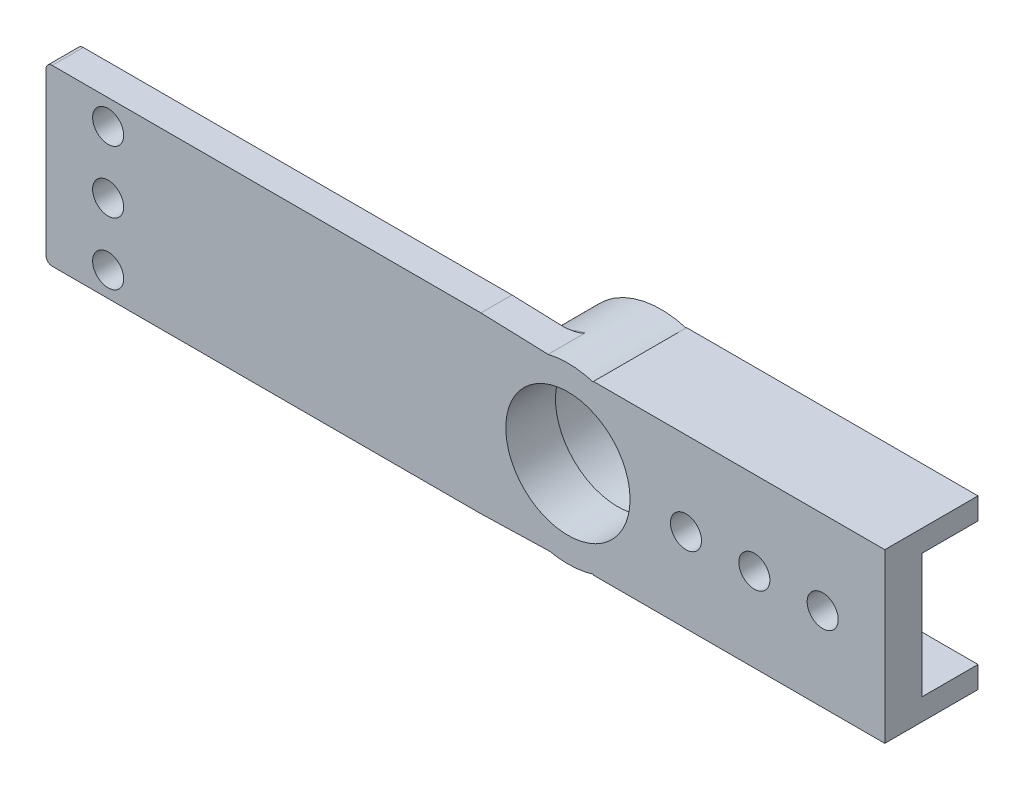
ISO-10303-21;
HEADER;
FILE_DESCRIPTION(('STEP AP214'),'2;1');
FILE_NAME('part.step','',(''),(''),'','','');
FILE_SCHEMA(('AUTOMOTIVE_DESIGN { 1 0 10303 214 1 1 1 1 }'));
ENDSEC;
DATA;
#1=APPLICATION_CONTEXT('core data for automotive mechanical design processes');
#2=APPLICATION_PROTOCOL_DEFINITION('international standard','automotive_design',2000,#1);
#3=PRODUCT_CONTEXT('',#1,'mechanical');
#4=PRODUCT('Part','Part','',(#3));
#5=PRODUCT_RELATED_PRODUCT_CATEGORY('part','',(#4));
#6=PRODUCT_DEFINITION_FORMATION('','',#4);
#7=PRODUCT_DEFINITION_CONTEXT('part definition',#1,'design');
#8=PRODUCT_DEFINITION('design','',#6,#7);
#9=PRODUCT_DEFINITION_SHAPE('','',#8);
#10=(LENGTH_UNIT() NAMED_UNIT(*) SI_UNIT(.MILLI.,.METRE.));
#11=(NAMED_UNIT(*) PLANE_ANGLE_UNIT() SI_UNIT($,.RADIAN.));
#12=(NAMED_UNIT(*) SI_UNIT($,.STERADIAN.) SOLID_ANGLE_UNIT());
#13=UNCERTAINTY_MEASURE_WITH_UNIT(LENGTH_MEASURE(1.E-05),#10,'distance_accuracy_value','');
#14=(GEOMETRIC_REPRESENTATION_CONTEXT(3) GLOBAL_UNCERTAINTY_ASSIGNED_CONTEXT((#13)) GLOBAL_UNIT_ASSIGNED_CONTEXT((#10,
#11,#12)) REPRESENTATION_CONTEXT('',''));
#15=CARTESIAN_POINT('',(0.,0.,0.));
#16=DIRECTION('',(0.,0.,1.));
#17=DIRECTION('',(1.,0.,0.));
#18=AXIS2_PLACEMENT_3D('',#15,#16,#17);
#19=CARTESIAN_POINT('',(-31.,0.,-9.));
#20=DIRECTION('',(0.,0.,1.));
#21=DIRECTION('',(1.,0.,0.));
#22=AXIS2_PLACEMENT_3D('',#19,#20,#21);
#23=CYLINDRICAL_SURFACE('',#22,14.);
#24=DIRECTION('',(0.,0.,1.));
#25=VECTOR('',#24,1.);
#26=CARTESIAN_POINT('',(-33.911999364578,-13.6938036973186,1.));
#27=LINE('',#26,#25);
#28=CARTESIAN_POINT('',(-33.911999364578,-13.6938036973186,0.));
#29=VERTEX_POINT('',#28);
#30=CARTESIAN_POINT('',(-33.911999364578,-13.6938036973186,6.));
#31=VERTEX_POINT('',#30);
#32=EDGE_CURVE('E200',#29,#31,#27,.T.);
#33=ORIENTED_EDGE('',*,*,#32,.F.);
#34=CARTESIAN_POINT('',(-31.,0.,0.));
#35=DIRECTION('',(0.,0.,1.));
#36=DIRECTION('',(1.,0.,0.));
#37=AXIS2_PLACEMENT_3D('',#34,#35,#36);
#38=CIRCLE('',#37,14.);
#39=CARTESIAN_POINT('',(-34.1873805210088,13.632336755461,0.));
#40=VERTEX_POINT('',#39);
#41=EDGE_CURVE('E426',#29,#40,#38,.F.);
#42=ORIENTED_EDGE('',*,*,#41,.T.);
#43=DIRECTION('',(0.,0.,1.));
#44=VECTOR('',#43,1.);
#45=CARTESIAN_POINT('',(-34.1873805210088,13.632336755461,1.));
#46=LINE('',#45,#44);
#47=CARTESIAN_POINT('',(-34.1873805210088,13.632336755461,6.));
#48=VERTEX_POINT('',#47);
#49=EDGE_CURVE('E245',#40,#48,#46,.T.);
#50=ORIENTED_EDGE('',*,*,#49,.T.);
#51=CARTESIAN_POINT('',(-31.,0.,6.));
#52=DIRECTION('',(0.,0.,1.));
#53=DIRECTION('',(1.,0.,0.));
#54=AXIS2_PLACEMENT_3D('',#51,#52,#53);
#55=CIRCLE('',#54,14.);
#56=CARTESIAN_POINT('',(-26.8939671408107,13.3843376436512,6.));
#57=VERTEX_POINT('',#56);
#58=EDGE_CURVE('E318',#57,#48,#55,.T.);
#59=ORIENTED_EDGE('',*,*,#58,.F.);
#60=DIRECTION('',(0.,0.,1.));
#61=VECTOR('',#60,1.);
#62=CARTESIAN_POINT('',(-26.8939671408107,13.3843376436512,-9.));
#63=LINE('',#62,#61);
#64=CARTESIAN_POINT('',(-26.8939671408107,13.3843376436512,-9.));
#65=VERTEX_POINT('',#64);
#66=EDGE_CURVE('E354',#65,#57,#63,.T.);
#67=ORIENTED_EDGE('',*,*,#66,.F.);
#68=CARTESIAN_POINT('',(-31.,0.,-9.));
#69=DIRECTION('',(0.,0.,1.));
#70=DIRECTION('',(1.,0.,0.));
#71=AXIS2_PLACEMENT_3D('',#68,#69,#70);
#72=CIRCLE('',#71,14.);
#73=CARTESIAN_POINT('',(-26.8939671408107,-13.3843376436512,-9.));
#74=VERTEX_POINT('',#73);
#75=EDGE_CURVE('E286',#65,#74,#72,.T.);
#76=ORIENTED_EDGE('',*,*,#75,.T.);
#77=DIRECTION('',(0.,0.,1.));
#78=VECTOR('',#77,1.);
#79=CARTESIAN_POINT('',(-26.8939671408107,-13.3843376436512,-9.));
#80=LINE('',#79,#78);
#81=CARTESIAN_POINT('',(-26.8939671408107,-13.3843376436512,6.));
#82=VERTEX_POINT('',#81);
#83=EDGE_CURVE('E350',#74,#82,#80,.T.);
#84=ORIENTED_EDGE('',*,*,#83,.T.);
#85=EDGE_CURVE('E317',#31,#82,#55,.T.);
#86=ORIENTED_EDGE('',*,*,#85,.F.);
#87=EDGE_LOOP('',(#33,#42,#50,#59,#67,#76,#84,#86));
#88=FACE_BOUND('',#87,.T.);
#89=ADVANCED_FACE('F45',(#88),#23,.T.);
#90=CARTESIAN_POINT('',(-31.,0.,-9.));
#91=DIRECTION('',(0.,0.,1.));
#92=DIRECTION('',(1.,0.,0.));
#93=AXIS2_PLACEMENT_3D('',#90,#91,#92);
#94=CYLINDRICAL_SURFACE('',#93,11.);
#95=CARTESIAN_POINT('',(-31.,0.,-9.));
#96=DIRECTION('',(0.,0.,1.));
#97=DIRECTION('',(1.,0.,0.));
#98=AXIS2_PLACEMENT_3D('',#95,#96,#97);
#99=CIRCLE('',#98,11.);
#100=CARTESIAN_POINT('',(-20.,0.,-9.));
#101=VERTEX_POINT('',#100);
#102=EDGE_CURVE('E259',#101,#101,#99,.T.);
#103=ORIENTED_EDGE('',*,*,#102,.F.);
#104=EDGE_LOOP('',(#103));
#105=FACE_BOUND('',#104,.T.);
#106=CARTESIAN_POINT('',(-31.,0.,-2.));
#107=DIRECTION('',(0.,0.,1.));
#108=DIRECTION('',(1.,0.,0.));
#109=AXIS2_PLACEMENT_3D('',#106,#107,#108);
#110=CIRCLE('',#109,11.);
#111=CARTESIAN_POINT('',(-20.,0.,-2.));
#112=VERTEX_POINT('',#111);
#113=EDGE_CURVE('E420',#112,#112,#110,.F.);
#114=ORIENTED_EDGE('',*,*,#113,.F.);
#115=EDGE_LOOP('',(#114));
#116=FACE_BOUND('',#115,.T.);
#117=ADVANCED_FACE('F496',(#105,#116),#94,.F.);
#118=CARTESIAN_POINT('',(20.,-10.,6.));
#119=DIRECTION('',(-1.,0.,0.));
#120=DIRECTION('',(0.,0.,1.));
#121=AXIS2_PLACEMENT_3D('',#118,#119,#120);
#122=PLANE('',#121);
#123=DIRECTION('',(0.,1.,0.));
#124=VECTOR('',#123,1.);
#125=CARTESIAN_POINT('',(20.,-10.,0.));
#126=LINE('',#125,#124);
#127=CARTESIAN_POINT('',(20.,-10.,0.));
#128=VERTEX_POINT('',#127);
#129=CARTESIAN_POINT('',(20.,10.,0.));
#130=VERTEX_POINT('',#129);
#131=EDGE_CURVE('E412',#128,#130,#126,.T.);
#132=ORIENTED_EDGE('',*,*,#131,.T.);
#133=DIRECTION('',(0.,0.,1.));
#134=VECTOR('',#133,1.);
#135=CARTESIAN_POINT('',(20.,10.,-9.));
#136=LINE('',#135,#134);
#137=CARTESIAN_POINT('',(20.,10.,-9.));
#138=VERTEX_POINT('',#137);
#139=EDGE_CURVE('E364',#138,#130,#136,.T.);
#140=ORIENTED_EDGE('',*,*,#139,.F.);
#141=DIRECTION('',(0.,-1.,0.));
#142=VECTOR('',#141,1.);
#143=CARTESIAN_POINT('',(20.,0.,-9.));
#144=LINE('',#143,#142);
#145=CARTESIAN_POINT('',(20.,13.5,-9.));
#146=VERTEX_POINT('',#145);
#147=EDGE_CURVE('E275',#146,#138,#144,.T.);
#148=ORIENTED_EDGE('',*,*,#147,.F.);
#149=DIRECTION('',(0.,0.,1.));
#150=VECTOR('',#149,1.);
#151=CARTESIAN_POINT('',(20.,13.5,-9.));
#152=LINE('',#151,#150);
#153=CARTESIAN_POINT('',(20.,13.5,6.));
#154=VERTEX_POINT('',#153);
#155=EDGE_CURVE('E360',#146,#154,#152,.T.);
#156=ORIENTED_EDGE('',*,*,#155,.T.);
#157=DIRECTION('',(0.,1.,0.));
#158=VECTOR('',#157,1.);
#159=CARTESIAN_POINT('',(20.,-10.,6.));
#160=LINE('',#159,#158);
#161=CARTESIAN_POINT('',(20.,-13.5,6.));
#162=VERTEX_POINT('',#161);
#163=EDGE_CURVE('E399',#162,#154,#160,.T.);
#164=ORIENTED_EDGE('',*,*,#163,.F.);
#165=DIRECTION('',(0.,0.,1.));
#166=VECTOR('',#165,1.);
#167=CARTESIAN_POINT('',(20.,-13.5,-9.));
#168=LINE('',#167,#166);
#169=CARTESIAN_POINT('',(20.,-13.5,-9.));
#170=VERTEX_POINT('',#169);
#171=EDGE_CURVE('E342',#170,#162,#168,.T.);
#172=ORIENTED_EDGE('',*,*,#171,.F.);
#173=DIRECTION('',(0.,-1.,0.));
#174=VECTOR('',#173,1.);
#175=CARTESIAN_POINT('',(20.,0.,-9.));
#176=LINE('',#175,#174);
#177=CARTESIAN_POINT('',(20.,-10.,-9.));
#178=VERTEX_POINT('',#177);
#179=EDGE_CURVE('E297',#178,#170,#176,.T.);
#180=ORIENTED_EDGE('',*,*,#179,.F.);
#181=DIRECTION('',(0.,0.,1.));
#182=VECTOR('',#181,1.);
#183=CARTESIAN_POINT('',(20.,-10.,-9.));
#184=LINE('',#183,#182);
#185=EDGE_CURVE('E338',#178,#128,#184,.T.);
#186=ORIENTED_EDGE('',*,*,#185,.T.);
#187=EDGE_LOOP('',(#132,#140,#148,#156,#164,#172,#180,#186));
#188=FACE_BOUND('',#187,.T.);
#189=ADVANCED_FACE('F516',(#188),#122,.F.);
#190=CARTESIAN_POINT('',(0.,0.,6.));
#191=DIRECTION('',(0.,0.,1.));
#192=DIRECTION('',(1.,0.,0.));
#193=AXIS2_PLACEMENT_3D('',#190,#191,#192);
#194=PLANE('',#193);
#195=CARTESIAN_POINT('',(-105.,-10.,6.));
#196=DIRECTION('',(0.,0.,1.));
#197=DIRECTION('',(1.,0.,0.));
#198=AXIS2_PLACEMENT_3D('',#195,#196,#197);
#199=CIRCLE('',#198,2.5);
#200=CARTESIAN_POINT('',(-102.5,-10.,6.));
#201=VERTEX_POINT('',#200);
#202=EDGE_CURVE('E651',#201,#201,#199,.T.);
#203=ORIENTED_EDGE('',*,*,#202,.F.);
#204=EDGE_LOOP('',(#203));
#205=FACE_BOUND('',#204,.T.);
#206=CARTESIAN_POINT('',(-105.,10.,6.));
#207=DIRECTION('',(0.,0.,1.));
#208=DIRECTION('',(1.,0.,0.));
#209=AXIS2_PLACEMENT_3D('',#206,#207,#208);
#210=CIRCLE('',#209,2.5);
#211=CARTESIAN_POINT('',(-102.5,10.,6.));
#212=VERTEX_POINT('',#211);
#213=EDGE_CURVE('E642',#212,#212,#210,.T.);
#214=ORIENTED_EDGE('',*,*,#213,.F.);
#215=EDGE_LOOP('',(#214));
#216=FACE_BOUND('',#215,.T.);
#217=CARTESIAN_POINT('',(-105.,0.,6.));
#218=DIRECTION('',(0.,0.,1.));
#219=DIRECTION('',(1.,0.,0.));
#220=AXIS2_PLACEMENT_3D('',#217,#218,#219);
#221=CIRCLE('',#220,2.5);
#222=CARTESIAN_POINT('',(-102.5,0.,6.));
#223=VERTEX_POINT('',#222);
#224=EDGE_CURVE('E645',#223,#223,#221,.T.);
#225=ORIENTED_EDGE('',*,*,#224,.F.);
#226=EDGE_LOOP('',(#225));
#227=FACE_BOUND('',#226,.T.);
#228=DIRECTION('',(-1.,0.,0.));
#229=VECTOR('',#228,1.);
#230=CARTESIAN_POINT('',(0.,13.9999999999999,6.));
#231=LINE('',#230,#229);
#232=CARTESIAN_POINT('',(-45.,14.,6.));
#233=VERTEX_POINT('',#232);
#234=CARTESIAN_POINT('',(-114.,14.0000000000001,6.));
#235=VERTEX_POINT('',#234);
#236=EDGE_CURVE('E237',#233,#235,#231,.T.);
#237=ORIENTED_EDGE('',*,*,#236,.T.);
#238=CARTESIAN_POINT('',(-114.,13.0000000000001,6.));
#239=DIRECTION('',(0.,0.,1.));
#240=DIRECTION('',(1.,0.,0.));
#241=AXIS2_PLACEMENT_3D('',#238,#239,#240);
#242=CIRCLE('',#241,1.);
#243=CARTESIAN_POINT('',(-115.,13.0000000000001,6.));
#244=VERTEX_POINT('',#243);
#245=EDGE_CURVE('E583',#235,#244,#242,.T.);
#246=ORIENTED_EDGE('',*,*,#245,.T.);
#247=DIRECTION('',(0.,1.,0.));
#248=VECTOR('',#247,1.);
#249=CARTESIAN_POINT('',(-115.,0.,6.));
#250=LINE('',#249,#248);
#251=CARTESIAN_POINT('',(-115.,-12.9999999999999,6.));
#252=VERTEX_POINT('',#251);
#253=EDGE_CURVE('E225',#252,#244,#250,.T.);
#254=ORIENTED_EDGE('',*,*,#253,.F.);
#255=CARTESIAN_POINT('',(-114.,-12.9999999999999,6.));
#256=DIRECTION('',(0.,0.,1.));
#257=DIRECTION('',(1.,0.,0.));
#258=AXIS2_PLACEMENT_3D('',#255,#256,#257);
#259=CIRCLE('',#258,1.);
#260=CARTESIAN_POINT('',(-114.,-13.9999999999999,6.));
#261=VERTEX_POINT('',#260);
#262=EDGE_CURVE('E580',#252,#261,#259,.T.);
#263=ORIENTED_EDGE('',*,*,#262,.T.);
#264=DIRECTION('',(-1.,0.,0.));
#265=VECTOR('',#264,1.);
#266=CARTESIAN_POINT('',(0.,-14.0000000000001,6.));
#267=LINE('',#266,#265);
#268=CARTESIAN_POINT('',(-45.,-14.,6.));
#269=VERTEX_POINT('',#268);
#270=EDGE_CURVE('E228',#269,#261,#267,.T.);
#271=ORIENTED_EDGE('',*,*,#270,.F.);
#272=DIRECTION('',(0.999618920928315,0.0276045815420301,0.));
#273=VECTOR('',#272,1.);
#274=CARTESIAN_POINT('',(0.352026286697129,-12.747599028473,6.));
#275=LINE('',#274,#273);
#276=EDGE_CURVE('E197',#269,#31,#275,.T.);
#277=ORIENTED_EDGE('',*,*,#276,.T.);
#278=ORIENTED_EDGE('',*,*,#85,.T.);
#279=DIRECTION('',(0.,1.,0.));
#280=VECTOR('',#279,1.);
#281=CARTESIAN_POINT('',(-26.8939671408107,0.,6.));
#282=LINE('',#281,#280);
#283=CARTESIAN_POINT('',(-26.8939671408107,-13.5,6.));
#284=VERTEX_POINT('',#283);
#285=EDGE_CURVE('E322',#284,#82,#282,.T.);
#286=ORIENTED_EDGE('',*,*,#285,.F.);
#287=DIRECTION('',(-1.,0.,0.));
#288=VECTOR('',#287,1.);
#289=CARTESIAN_POINT('',(0.,-13.5,6.));
#290=LINE('',#289,#288);
#291=EDGE_CURVE('E264',#162,#284,#290,.T.);
#292=ORIENTED_EDGE('',*,*,#291,.F.);
#293=ORIENTED_EDGE('',*,*,#163,.T.);
#294=DIRECTION('',(-1.,0.,0.));
#295=VECTOR('',#294,1.);
#296=CARTESIAN_POINT('',(0.,13.5,6.));
#297=LINE('',#296,#295);
#298=CARTESIAN_POINT('',(-26.8939671408107,13.5,6.));
#299=VERTEX_POINT('',#298);
#300=EDGE_CURVE('E255',#154,#299,#297,.T.);
#301=ORIENTED_EDGE('',*,*,#300,.T.);
#302=DIRECTION('',(0.,1.,0.));
#303=VECTOR('',#302,1.);
#304=CARTESIAN_POINT('',(-26.8939671408107,0.,6.));
#305=LINE('',#304,#303);
#306=EDGE_CURVE('E313',#57,#299,#305,.T.);
#307=ORIENTED_EDGE('',*,*,#306,.F.);
#308=ORIENTED_EDGE('',*,*,#58,.T.);
#309=DIRECTION('',(0.999422393339672,-0.0339835208770759,0.));
#310=VECTOR('',#309,1.);
#311=CARTESIAN_POINT('',(0.423524898662943,12.4554565547147,6.));
#312=LINE('',#311,#310);
#313=EDGE_CURVE('E234',#233,#48,#312,.T.);
#314=ORIENTED_EDGE('',*,*,#313,.F.);
#315=EDGE_LOOP('',(#237,#246,#254,#263,#271,#277,#278,#286,#292,#293,#301,#307,#308,#314));
#316=FACE_BOUND('',#315,.T.);
#317=CARTESIAN_POINT('',(10.,0.,6.));
#318=DIRECTION('',(0.,0.,1.));
#319=DIRECTION('',(1.,0.,0.));
#320=AXIS2_PLACEMENT_3D('',#317,#318,#319);
#321=CIRCLE('',#320,2.5);
#322=CARTESIAN_POINT('',(12.5,0.,6.));
#323=VERTEX_POINT('',#322);
#324=EDGE_CURVE('E380',#323,#323,#321,.T.);
#325=ORIENTED_EDGE('',*,*,#324,.F.);
#326=EDGE_LOOP('',(#325));
#327=FACE_BOUND('',#326,.T.);
#328=CARTESIAN_POINT('',(-0.999999999999999,0.,6.));
#329=DIRECTION('',(0.,0.,1.));
#330=DIRECTION('',(1.,0.,0.));
#331=AXIS2_PLACEMENT_3D('',#328,#329,#330);
#332=CIRCLE('',#331,2.5);
#333=CARTESIAN_POINT('',(1.5,0.,6.));
#334=VERTEX_POINT('',#333);
#335=EDGE_CURVE('E384',#334,#334,#332,.T.);
#336=ORIENTED_EDGE('',*,*,#335,.F.);
#337=EDGE_LOOP('',(#336));
#338=FACE_BOUND('',#337,.T.);
#339=CARTESIAN_POINT('',(-12.,-1.53625178909098E-13,6.));
#340=DIRECTION('',(0.,0.,1.));
#341=DIRECTION('',(1.,0.,0.));
#342=AXIS2_PLACEMENT_3D('',#339,#340,#341);
#343=CIRCLE('',#342,2.5);
#344=CARTESIAN_POINT('',(-9.5,-1.53625178909098E-13,6.));
#345=VERTEX_POINT('',#344);
#346=EDGE_CURVE('E392',#345,#345,#343,.T.);
#347=ORIENTED_EDGE('',*,*,#346,.F.);
#348=EDGE_LOOP('',(#347));
#349=FACE_BOUND('',#348,.T.);
#350=CARTESIAN_POINT('',(-31.,0.,6.));
#351=DIRECTION('',(0.,0.,1.));
#352=DIRECTION('',(1.,0.,0.));
#353=AXIS2_PLACEMENT_3D('',#350,#351,#352);
#354=CIRCLE('',#353,10.);
#355=CARTESIAN_POINT('',(-21.,0.,6.));
#356=VERTEX_POINT('',#355);
#357=EDGE_CURVE('E244',#356,#356,#354,.T.);
#358=ORIENTED_EDGE('',*,*,#357,.F.);
#359=EDGE_LOOP('',(#358));
#360=FACE_BOUND('',#359,.T.);
#361=ADVANCED_FACE('F530',(#205,#216,#227,#316,#327,#338,#349,#360),#194,.T.);
#362=CARTESIAN_POINT('',(0.,0.,0.));
#363=DIRECTION('',(0.,0.,1.));
#364=DIRECTION('',(1.,0.,0.));
#365=AXIS2_PLACEMENT_3D('',#362,#363,#364);
#366=PLANE('',#365);
#367=CARTESIAN_POINT('',(10.,0.,0.));
#368=DIRECTION('',(0.,0.,1.));
#369=DIRECTION('',(1.,0.,0.));
#370=AXIS2_PLACEMENT_3D('',#367,#368,#369);
#371=CIRCLE('',#370,2.5);
#372=CARTESIAN_POINT('',(12.5,0.,0.));
#373=VERTEX_POINT('',#372);
#374=EDGE_CURVE('E375',#373,#373,#371,.T.);
#375=ORIENTED_EDGE('',*,*,#374,.T.);
#376=EDGE_LOOP('',(#375));
#377=FACE_BOUND('',#376,.T.);
#378=CARTESIAN_POINT('',(-0.999999999999999,0.,0.));
#379=DIRECTION('',(0.,0.,1.));
#380=DIRECTION('',(1.,0.,0.));
#381=AXIS2_PLACEMENT_3D('',#378,#379,#380);
#382=CIRCLE('',#381,2.5);
#383=CARTESIAN_POINT('',(1.5,0.,0.));
#384=VERTEX_POINT('',#383);
#385=EDGE_CURVE('E388',#384,#384,#382,.T.);
#386=ORIENTED_EDGE('',*,*,#385,.T.);
#387=EDGE_LOOP('',(#386));
#388=FACE_BOUND('',#387,.T.);
#389=CARTESIAN_POINT('',(-12.,-1.53625178909098E-13,0.));
#390=DIRECTION('',(0.,0.,1.));
#391=DIRECTION('',(1.,0.,0.));
#392=AXIS2_PLACEMENT_3D('',#389,#390,#391);
#393=CIRCLE('',#392,2.5);
#394=CARTESIAN_POINT('',(-9.5,-1.53625178909098E-13,0.));
#395=VERTEX_POINT('',#394);
#396=EDGE_CURVE('E333',#395,#395,#393,.T.);
#397=ORIENTED_EDGE('',*,*,#396,.T.);
#398=EDGE_LOOP('',(#397));
#399=FACE_BOUND('',#398,.T.);
#400=DIRECTION('',(0.,-1.,0.));
#401=VECTOR('',#400,1.);
#402=CARTESIAN_POINT('',(-20.,-10.,0.));
#403=LINE('',#402,#401);
#404=CARTESIAN_POINT('',(-20.,-8.66025403784439,0.));
#405=VERTEX_POINT('',#404);
#406=CARTESIAN_POINT('',(-20.,-10.,0.));
#407=VERTEX_POINT('',#406);
#408=EDGE_CURVE('E379',#405,#407,#403,.T.);
#409=ORIENTED_EDGE('',*,*,#408,.F.);
#410=CARTESIAN_POINT('',(-31.,0.,0.));
#411=DIRECTION('',(0.,0.,1.));
#412=DIRECTION('',(1.,0.,0.));
#413=AXIS2_PLACEMENT_3D('',#410,#411,#412);
#414=CIRCLE('',#413,14.);
#415=CARTESIAN_POINT('',(-20.,8.66025403784439,0.));
#416=VERTEX_POINT('',#415);
#417=EDGE_CURVE('E402',#405,#416,#414,.T.);
#418=ORIENTED_EDGE('',*,*,#417,.T.);
#419=CARTESIAN_POINT('',(-20.,10.,0.));
#420=VERTEX_POINT('',#419);
#421=EDGE_CURVE('E404',#420,#416,#403,.T.);
#422=ORIENTED_EDGE('',*,*,#421,.F.);
#423=DIRECTION('',(-1.,0.,0.));
#424=VECTOR('',#423,1.);
#425=CARTESIAN_POINT('',(20.,10.,0.));
#426=LINE('',#425,#424);
#427=EDGE_CURVE('E403',#130,#420,#426,.T.);
#428=ORIENTED_EDGE('',*,*,#427,.F.);
#429=ORIENTED_EDGE('',*,*,#131,.F.);
#430=DIRECTION('',(1.,0.,0.));
#431=VECTOR('',#430,1.);
#432=CARTESIAN_POINT('',(20.,-10.,0.));
#433=LINE('',#432,#431);
#434=EDGE_CURVE('E408',#407,#128,#433,.T.);
#435=ORIENTED_EDGE('',*,*,#434,.F.);
#436=EDGE_LOOP('',(#409,#418,#422,#428,#429,#435));
#437=FACE_BOUND('',#436,.T.);
#438=ADVANCED_FACE('F528',(#377,#388,#399,#437),#366,.F.);
#439=CARTESIAN_POINT('',(-12.,-1.53625178909098E-13,0.));
#440=DIRECTION('',(0.,0.,1.));
#441=DIRECTION('',(1.,0.,0.));
#442=AXIS2_PLACEMENT_3D('',#439,#440,#441);
#443=CYLINDRICAL_SURFACE('',#442,2.5);
#444=ORIENTED_EDGE('',*,*,#396,.F.);
#445=EDGE_LOOP('',(#444));
#446=FACE_BOUND('',#445,.T.);
#447=ORIENTED_EDGE('',*,*,#346,.T.);
#448=EDGE_LOOP('',(#447));
#449=FACE_BOUND('',#448,.T.);
#450=ADVANCED_FACE('F524',(#446,#449),#443,.F.);
#451=CARTESIAN_POINT('',(-0.999999999999999,0.,0.));
#452=DIRECTION('',(0.,0.,1.));
#453=DIRECTION('',(1.,0.,0.));
#454=AXIS2_PLACEMENT_3D('',#451,#452,#453);
#455=CYLINDRICAL_SURFACE('',#454,2.5);
#456=ORIENTED_EDGE('',*,*,#385,.F.);
#457=EDGE_LOOP('',(#456));
#458=FACE_BOUND('',#457,.T.);
#459=ORIENTED_EDGE('',*,*,#335,.T.);
#460=EDGE_LOOP('',(#459));
#461=FACE_BOUND('',#460,.T.);
#462=ADVANCED_FACE('F520',(#458,#461),#455,.F.);
#463=CARTESIAN_POINT('',(10.,0.,0.));
#464=DIRECTION('',(0.,0.,1.));
#465=DIRECTION('',(1.,0.,0.));
#466=AXIS2_PLACEMENT_3D('',#463,#464,#465);
#467=CYLINDRICAL_SURFACE('',#466,2.5);
#468=ORIENTED_EDGE('',*,*,#374,.F.);
#469=EDGE_LOOP('',(#468));
#470=FACE_BOUND('',#469,.T.);
#471=ORIENTED_EDGE('',*,*,#324,.T.);
#472=EDGE_LOOP('',(#471));
#473=FACE_BOUND('',#472,.T.);
#474=ADVANCED_FACE('F512',(#470,#473),#467,.F.);
#475=CARTESIAN_POINT('',(-31.,0.,-9.));
#476=DIRECTION('',(0.,0.,1.));
#477=DIRECTION('',(1.,0.,0.));
#478=AXIS2_PLACEMENT_3D('',#475,#476,#477);
#479=CYLINDRICAL_SURFACE('',#478,14.);
#480=ORIENTED_EDGE('',*,*,#417,.F.);
#481=DIRECTION('',(0.,0.,1.));
#482=VECTOR('',#481,1.);
#483=CARTESIAN_POINT('',(-20.,-8.66025403784439,-9.));
#484=LINE('',#483,#482);
#485=CARTESIAN_POINT('',(-20.,-8.66025403784439,-9.));
#486=VERTEX_POINT('',#485);
#487=EDGE_CURVE('E329',#486,#405,#484,.T.);
#488=ORIENTED_EDGE('',*,*,#487,.F.);
#489=CARTESIAN_POINT('',(-31.,0.,-9.));
#490=DIRECTION('',(0.,0.,1.));
#491=DIRECTION('',(1.,0.,0.));
#492=AXIS2_PLACEMENT_3D('',#489,#490,#491);
#493=CIRCLE('',#492,14.);
#494=CARTESIAN_POINT('',(-20.,8.66025403784439,-9.));
#495=VERTEX_POINT('',#494);
#496=EDGE_CURVE('E263',#486,#495,#493,.T.);
#497=ORIENTED_EDGE('',*,*,#496,.T.);
#498=DIRECTION('',(0.,0.,1.));
#499=VECTOR('',#498,1.);
#500=CARTESIAN_POINT('',(-20.,8.66025403784439,-9.));
#501=LINE('',#500,#499);
#502=EDGE_CURVE('E309',#495,#416,#501,.T.);
#503=ORIENTED_EDGE('',*,*,#502,.T.);
#504=EDGE_LOOP('',(#480,#488,#497,#503));
#505=FACE_BOUND('',#504,.T.);
#506=ADVANCED_FACE('F478',(#505),#479,.T.);
#507=CARTESIAN_POINT('',(-20.,0.,-9.));
#508=DIRECTION('',(-1.,0.,0.));
#509=DIRECTION('',(0.,0.,1.));
#510=AXIS2_PLACEMENT_3D('',#507,#508,#509);
#511=PLANE('',#510);
#512=ORIENTED_EDGE('',*,*,#487,.T.);
#513=ORIENTED_EDGE('',*,*,#408,.T.);
#514=DIRECTION('',(0.,0.,1.));
#515=VECTOR('',#514,1.);
#516=CARTESIAN_POINT('',(-20.,-10.,-9.));
#517=LINE('',#516,#515);
#518=CARTESIAN_POINT('',(-20.,-10.,-9.));
#519=VERTEX_POINT('',#518);
#520=EDGE_CURVE('E334',#519,#407,#517,.T.);
#521=ORIENTED_EDGE('',*,*,#520,.F.);
#522=DIRECTION('',(0.,-1.,0.));
#523=VECTOR('',#522,1.);
#524=CARTESIAN_POINT('',(-20.,0.,-9.));
#525=LINE('',#524,#523);
#526=EDGE_CURVE('E305',#486,#519,#525,.T.);
#527=ORIENTED_EDGE('',*,*,#526,.F.);
#528=EDGE_LOOP('',(#512,#513,#521,#527));
#529=FACE_BOUND('',#528,.T.);
#530=ADVANCED_FACE('F474',(#529),#511,.F.);
#531=CARTESIAN_POINT('',(0.,-10.,-9.));
#532=DIRECTION('',(0.,-1.,0.));
#533=DIRECTION('',(1.,0.,0.));
#534=AXIS2_PLACEMENT_3D('',#531,#532,#533);
#535=PLANE('',#534);
#536=ORIENTED_EDGE('',*,*,#520,.T.);
#537=ORIENTED_EDGE('',*,*,#434,.T.);
#538=ORIENTED_EDGE('',*,*,#185,.F.);
#539=DIRECTION('',(1.,0.,0.));
#540=VECTOR('',#539,1.);
#541=CARTESIAN_POINT('',(0.,-10.,-9.));
#542=LINE('',#541,#540);
#543=EDGE_CURVE('E301',#519,#178,#542,.T.);
#544=ORIENTED_EDGE('',*,*,#543,.F.);
#545=EDGE_LOOP('',(#536,#537,#538,#544));
#546=FACE_BOUND('',#545,.T.);
#547=ADVANCED_FACE('F477',(#546),#535,.F.);
#548=CARTESIAN_POINT('',(0.,10.,-9.));
#549=DIRECTION('',(0.,1.,0.));
#550=DIRECTION('',(-1.,0.,0.));
#551=AXIS2_PLACEMENT_3D('',#548,#549,#550);
#552=PLANE('',#551);
#553=ORIENTED_EDGE('',*,*,#139,.T.);
#554=ORIENTED_EDGE('',*,*,#427,.T.);
#555=DIRECTION('',(0.,0.,1.));
#556=VECTOR('',#555,1.);
#557=CARTESIAN_POINT('',(-20.,10.,-9.));
#558=LINE('',#557,#556);
#559=CARTESIAN_POINT('',(-20.,10.,-9.));
#560=VERTEX_POINT('',#559);
#561=EDGE_CURVE('E368',#560,#420,#558,.T.);
#562=ORIENTED_EDGE('',*,*,#561,.F.);
#563=DIRECTION('',(-1.,0.,0.));
#564=VECTOR('',#563,1.);
#565=CARTESIAN_POINT('',(0.,10.,-9.));
#566=LINE('',#565,#564);
#567=EDGE_CURVE('E271',#138,#560,#566,.T.);
#568=ORIENTED_EDGE('',*,*,#567,.F.);
#569=EDGE_LOOP('',(#553,#554,#562,#568));
#570=FACE_BOUND('',#569,.T.);
#571=ADVANCED_FACE('F482',(#570),#552,.F.);
#572=CARTESIAN_POINT('',(-20.,0.,-9.));
#573=DIRECTION('',(-1.,0.,0.));
#574=DIRECTION('',(0.,0.,1.));
#575=AXIS2_PLACEMENT_3D('',#572,#573,#574);
#576=PLANE('',#575);
#577=ORIENTED_EDGE('',*,*,#561,.T.);
#578=ORIENTED_EDGE('',*,*,#421,.T.);
#579=ORIENTED_EDGE('',*,*,#502,.F.);
#580=DIRECTION('',(0.,-1.,0.));
#581=VECTOR('',#580,1.);
#582=CARTESIAN_POINT('',(-20.,0.,-9.));
#583=LINE('',#582,#581);
#584=EDGE_CURVE('E268',#560,#495,#583,.T.);
#585=ORIENTED_EDGE('',*,*,#584,.F.);
#586=EDGE_LOOP('',(#577,#578,#579,#585));
#587=FACE_BOUND('',#586,.T.);
#588=ADVANCED_FACE('F488',(#587),#576,.F.);
#589=CARTESIAN_POINT('',(0.,-13.5,-9.));
#590=DIRECTION('',(0.,1.,0.));
#591=DIRECTION('',(0.,0.,1.));
#592=AXIS2_PLACEMENT_3D('',#589,#590,#591);
#593=PLANE('',#592);
#594=ORIENTED_EDGE('',*,*,#291,.T.);
#595=DIRECTION('',(0.,0.,1.));
#596=VECTOR('',#595,1.);
#597=CARTESIAN_POINT('',(-26.8939671408107,-13.5,-9.));
#598=LINE('',#597,#596);
#599=CARTESIAN_POINT('',(-26.8939671408107,-13.5,-9.));
#600=VERTEX_POINT('',#599);
#601=EDGE_CURVE('E346',#600,#284,#598,.T.);
#602=ORIENTED_EDGE('',*,*,#601,.F.);
#603=DIRECTION('',(-1.,0.,0.));
#604=VECTOR('',#603,1.);
#605=CARTESIAN_POINT('',(0.,-13.5,-9.));
#606=LINE('',#605,#604);
#607=EDGE_CURVE('E293',#170,#600,#606,.T.);
#608=ORIENTED_EDGE('',*,*,#607,.F.);
#609=ORIENTED_EDGE('',*,*,#171,.T.);
#610=EDGE_LOOP('',(#594,#602,#608,#609));
#611=FACE_BOUND('',#610,.T.);
#612=ADVANCED_FACE('F484',(#611),#593,.F.);
#613=CARTESIAN_POINT('',(-26.8939671408107,0.,-9.));
#614=DIRECTION('',(1.,0.,0.));
#615=DIRECTION('',(0.,0.,-1.));
#616=AXIS2_PLACEMENT_3D('',#613,#614,#615);
#617=PLANE('',#616);
#618=ORIENTED_EDGE('',*,*,#285,.T.);
#619=ORIENTED_EDGE('',*,*,#83,.F.);
#620=DIRECTION('',(0.,1.,0.));
#621=VECTOR('',#620,1.);
#622=CARTESIAN_POINT('',(-26.8939671408107,0.,-9.));
#623=LINE('',#622,#621);
#624=EDGE_CURVE('E290',#600,#74,#623,.T.);
#625=ORIENTED_EDGE('',*,*,#624,.F.);
#626=ORIENTED_EDGE('',*,*,#601,.T.);
#627=EDGE_LOOP('',(#618,#619,#625,#626));
#628=FACE_BOUND('',#627,.T.);
#629=ADVANCED_FACE('F487',(#628),#617,.F.);
#630=CARTESIAN_POINT('',(-26.8939671408107,0.,-9.));
#631=DIRECTION('',(1.,0.,0.));
#632=DIRECTION('',(0.,0.,-1.));
#633=AXIS2_PLACEMENT_3D('',#630,#631,#632);
#634=PLANE('',#633);
#635=ORIENTED_EDGE('',*,*,#306,.T.);
#636=DIRECTION('',(0.,0.,1.));
#637=VECTOR('',#636,1.);
#638=CARTESIAN_POINT('',(-26.8939671408107,13.5,-9.));
#639=LINE('',#638,#637);
#640=CARTESIAN_POINT('',(-26.8939671408107,13.5,-9.));
#641=VERTEX_POINT('',#640);
#642=EDGE_CURVE('E357',#641,#299,#639,.T.);
#643=ORIENTED_EDGE('',*,*,#642,.F.);
#644=DIRECTION('',(0.,1.,0.));
#645=VECTOR('',#644,1.);
#646=CARTESIAN_POINT('',(-26.8939671408107,0.,-9.));
#647=LINE('',#646,#645);
#648=EDGE_CURVE('E283',#65,#641,#647,.T.);
#649=ORIENTED_EDGE('',*,*,#648,.F.);
#650=ORIENTED_EDGE('',*,*,#66,.T.);
#651=EDGE_LOOP('',(#635,#643,#649,#650));
#652=FACE_BOUND('',#651,.T.);
#653=ADVANCED_FACE('F492',(#652),#634,.F.);
#654=CARTESIAN_POINT('',(0.,13.5,-9.));
#655=DIRECTION('',(0.,1.,0.));
#656=DIRECTION('',(-1.,0.,0.));
#657=AXIS2_PLACEMENT_3D('',#654,#655,#656);
#658=PLANE('',#657);
#659=ORIENTED_EDGE('',*,*,#300,.F.);
#660=ORIENTED_EDGE('',*,*,#155,.F.);
#661=DIRECTION('',(-1.,0.,0.));
#662=VECTOR('',#661,1.);
#663=CARTESIAN_POINT('',(0.,13.5,-9.));
#664=LINE('',#663,#662);
#665=EDGE_CURVE('E279',#146,#641,#664,.T.);
#666=ORIENTED_EDGE('',*,*,#665,.T.);
#667=ORIENTED_EDGE('',*,*,#642,.T.);
#668=EDGE_LOOP('',(#659,#660,#666,#667));
#669=FACE_BOUND('',#668,.T.);
#670=ADVANCED_FACE('F472',(#669),#658,.T.);
#671=CARTESIAN_POINT('',(0.,0.,-9.));
#672=DIRECTION('',(0.,0.,1.));
#673=DIRECTION('',(1.,0.,0.));
#674=AXIS2_PLACEMENT_3D('',#671,#672,#673);
#675=PLANE('',#674);
#676=ORIENTED_EDGE('',*,*,#102,.T.);
#677=EDGE_LOOP('',(#676));
#678=FACE_BOUND('',#677,.T.);
#679=ORIENTED_EDGE('',*,*,#496,.F.);
#680=ORIENTED_EDGE('',*,*,#526,.T.);
#681=ORIENTED_EDGE('',*,*,#543,.T.);
#682=ORIENTED_EDGE('',*,*,#179,.T.);
#683=ORIENTED_EDGE('',*,*,#607,.T.);
#684=ORIENTED_EDGE('',*,*,#624,.T.);
#685=ORIENTED_EDGE('',*,*,#75,.F.);
#686=ORIENTED_EDGE('',*,*,#648,.T.);
#687=ORIENTED_EDGE('',*,*,#665,.F.);
#688=ORIENTED_EDGE('',*,*,#147,.T.);
#689=ORIENTED_EDGE('',*,*,#567,.T.);
#690=ORIENTED_EDGE('',*,*,#584,.T.);
#691=EDGE_LOOP('',(#679,#680,#681,#682,#683,#684,#685,#686,#687,#688,#689,#690));
#692=FACE_BOUND('',#691,.T.);
#693=ADVANCED_FACE('F468',(#678,#692),#675,.F.);
#694=CARTESIAN_POINT('',(-31.,0.,-2.));
#695=DIRECTION('',(0.,0.,1.));
#696=DIRECTION('',(1.,0.,0.));
#697=AXIS2_PLACEMENT_3D('',#694,#695,#696);
#698=PLANE('',#697);
#699=CARTESIAN_POINT('',(-31.,0.,-2.));
#700=DIRECTION('',(0.,0.,1.));
#701=DIRECTION('',(1.,0.,0.));
#702=AXIS2_PLACEMENT_3D('',#699,#700,#701);
#703=CIRCLE('',#702,10.);
#704=CARTESIAN_POINT('',(-21.,0.,-2.));
#705=VERTEX_POINT('',#704);
#706=EDGE_CURVE('E251',#705,#705,#703,.T.);
#707=ORIENTED_EDGE('',*,*,#706,.T.);
#708=EDGE_LOOP('',(#707));
#709=FACE_BOUND('',#708,.T.);
#710=ORIENTED_EDGE('',*,*,#113,.T.);
#711=EDGE_LOOP('',(#710));
#712=FACE_BOUND('',#711,.T.);
#713=ADVANCED_FACE('F464',(#709,#712),#698,.F.);
#714=CARTESIAN_POINT('',(-31.,0.,-2.));
#715=DIRECTION('',(0.,0.,1.));
#716=DIRECTION('',(1.,0.,0.));
#717=AXIS2_PLACEMENT_3D('',#714,#715,#716);
#718=CYLINDRICAL_SURFACE('',#717,10.);
#719=ORIENTED_EDGE('',*,*,#706,.F.);
#720=EDGE_LOOP('',(#719));
#721=FACE_BOUND('',#720,.T.);
#722=ORIENTED_EDGE('',*,*,#357,.T.);
#723=EDGE_LOOP('',(#722));
#724=FACE_BOUND('',#723,.T.);
#725=ADVANCED_FACE('F461',(#721,#724),#718,.F.);
#726=CARTESIAN_POINT('',(-115.,0.,1.));
#727=DIRECTION('',(1.,0.,0.));
#728=DIRECTION('',(0.,0.,-1.));
#729=AXIS2_PLACEMENT_3D('',#726,#727,#728);
#730=PLANE('',#729);
#731=ORIENTED_EDGE('',*,*,#253,.T.);
#732=DIRECTION('',(0.,0.,1.));
#733=VECTOR('',#732,1.);
#734=CARTESIAN_POINT('',(-115.,13.0000000000001,1.));
#735=LINE('',#734,#733);
#736=CARTESIAN_POINT('',(-115.,13.0000000000001,1.));
#737=VERTEX_POINT('',#736);
#738=EDGE_CURVE('E67',#244,#737,#735,.F.);
#739=ORIENTED_EDGE('',*,*,#738,.T.);
#740=DIRECTION('',(0.,1.,0.));
#741=VECTOR('',#740,1.);
#742=CARTESIAN_POINT('',(-115.,0.,1.));
#743=LINE('',#742,#741);
#744=CARTESIAN_POINT('',(-115.,-12.9999999999999,1.));
#745=VERTEX_POINT('',#744);
#746=EDGE_CURVE('E208',#745,#737,#743,.T.);
#747=ORIENTED_EDGE('',*,*,#746,.F.);
#748=DIRECTION('',(0.,0.,1.));
#749=VECTOR('',#748,1.);
#750=CARTESIAN_POINT('',(-115.,-12.9999999999999,1.));
#751=LINE('',#750,#749);
#752=EDGE_CURVE('E588',#745,#252,#751,.T.);
#753=ORIENTED_EDGE('',*,*,#752,.T.);
#754=EDGE_LOOP('',(#731,#739,#747,#753));
#755=FACE_BOUND('',#754,.T.);
#756=ADVANCED_FACE('F457',(#755),#730,.F.);
#757=CARTESIAN_POINT('',(0.,13.9999999999999,1.));
#758=DIRECTION('',(0.,1.,0.));
#759=DIRECTION('',(-1.,0.,0.));
#760=AXIS2_PLACEMENT_3D('',#757,#758,#759);
#761=PLANE('',#760);
#762=DIRECTION('',(-1.,0.,0.));
#763=VECTOR('',#762,1.);
#764=CARTESIAN_POINT('',(0.,13.9999999999999,1.));
#765=LINE('',#764,#763);
#766=CARTESIAN_POINT('',(-45.,14.,1.));
#767=VERTEX_POINT('',#766);
#768=CARTESIAN_POINT('',(-114.,14.0000000000001,1.));
#769=VERTEX_POINT('',#768);
#770=EDGE_CURVE('E201',#767,#769,#765,.T.);
#771=ORIENTED_EDGE('',*,*,#770,.T.);
#772=DIRECTION('',(0.,0.,1.));
#773=VECTOR('',#772,1.);
#774=CARTESIAN_POINT('',(-114.,14.0000000000001,6.));
#775=LINE('',#774,#773);
#776=EDGE_CURVE('E575',#769,#235,#775,.T.);
#777=ORIENTED_EDGE('',*,*,#776,.T.);
#778=ORIENTED_EDGE('',*,*,#236,.F.);
#779=DIRECTION('',(0.,0.,1.));
#780=VECTOR('',#779,1.);
#781=CARTESIAN_POINT('',(-45.,14.,1.));
#782=LINE('',#781,#780);
#783=EDGE_CURVE('E241',#767,#233,#782,.T.);
#784=ORIENTED_EDGE('',*,*,#783,.F.);
#785=EDGE_LOOP('',(#771,#777,#778,#784));
#786=FACE_BOUND('',#785,.T.);
#787=ADVANCED_FACE('F460',(#786),#761,.T.);
#788=CARTESIAN_POINT('',(0.423524898662943,12.4554565547147,1.));
#789=DIRECTION('',(-0.0339835208770759,-0.999422393339672,0.));
#790=DIRECTION('',(0.999422393339672,-0.0339835208770759,0.));
#791=AXIS2_PLACEMENT_3D('',#788,#789,#790);
#792=PLANE('',#791);
#793=ORIENTED_EDGE('',*,*,#313,.T.);
#794=ORIENTED_EDGE('',*,*,#49,.F.);
#795=CARTESIAN_POINT('',(-34.1873805210088,13.632336755461,0.));
#796=CARTESIAN_POINT('',(-34.1873086857466,13.632334312835,0.0183395667176775));
#797=CARTESIAN_POINT('',(-34.1893118747166,13.6324024275927,0.0365630013017043));
#798=CARTESIAN_POINT('',(-34.196744897519,13.6326551738662,0.0719868752258515));
#799=CARTESIAN_POINT('',(-34.2021152391686,13.6328377824598,0.0891995144719637));
#800=CARTESIAN_POINT('',(-34.2173753322784,13.6333566738677,0.126848072643649));
#801=CARTESIAN_POINT('',(-34.2280820541797,13.6337207362598,0.146941728552138));
#802=CARTESIAN_POINT('',(-34.252530894605,13.6345520741251,0.18530834595942));
#803=CARTESIAN_POINT('',(-34.2662945515155,13.6350200819715,0.203566981898554));
#804=CARTESIAN_POINT('',(-34.3088803731158,13.6364681345337,0.253789497682567));
#805=CARTESIAN_POINT('',(-34.3402390966296,13.6375344302685,0.283561541772798));
#806=CARTESIAN_POINT('',(-34.4064558561897,13.6397860094265,0.338774202216822));
#807=CARTESIAN_POINT('',(-34.441321648059,13.6409715565723,0.364204867444762));
#808=CARTESIAN_POINT('',(-34.5074547830781,13.6432202922316,0.408164209978597));
#809=CARTESIAN_POINT('',(-34.5384226824398,13.6442732987096,0.427148913638906));
#810=CARTESIAN_POINT('',(-34.601378108994,13.6464139822353,0.463355135291737));
#811=CARTESIAN_POINT('',(-34.6333661243575,13.6475016758823,0.480575791988522));
#812=CARTESIAN_POINT('',(-34.7305327941134,13.6508056498299,0.530153960911473));
#813=CARTESIAN_POINT('',(-34.7968057435007,13.6530591396197,0.560359777680457));
#814=CARTESIAN_POINT('',(-34.9315860429666,13.6576420958865,0.616820141141722));
#815=CARTESIAN_POINT('',(-35.0001070102658,13.659972025392,0.643041206830119));
#816=CARTESIAN_POINT('',(-35.1382790082064,13.6646703101292,0.692052816296685));
#817=CARTESIAN_POINT('',(-35.2079288365804,13.66703862448,0.714846774192712));
#818=CARTESIAN_POINT('',(-35.3508252287159,13.6718975535552,0.758344928341559));
#819=CARTESIAN_POINT('',(-35.4241065971095,13.6743893517471,0.778933951273743));
#820=CARTESIAN_POINT('',(-35.571411494167,13.6793981839264,0.817264661273604));
#821=CARTESIAN_POINT('',(-35.6454351227515,13.6819152213113,0.835005959370459));
#822=CARTESIAN_POINT('',(-35.8685299683636,13.6895011513385,0.884246007163939));
#823=CARTESIAN_POINT('',(-36.0185136378726,13.6946010702496,0.911727735066648));
#824=CARTESIAN_POINT('',(-36.2415070084388,13.7021835498044,0.944564329081125));
#825=CARTESIAN_POINT('',(-36.3139496152629,13.7046468274513,0.953990998579576));
#826=CARTESIAN_POINT('',(-36.4591201372004,13.7095830841291,0.9703302226166));
#827=CARTESIAN_POINT('',(-36.5318480394035,13.7120560627208,0.977242889622741));
#828=CARTESIAN_POINT('',(-36.6773896426075,13.7170049373347,0.988435553839622));
#829=CARTESIAN_POINT('',(-36.7502030181252,13.7194808222894,0.992719762169461));
#830=CARTESIAN_POINT('',(-36.8959501010275,13.7244366838627,0.998497555125776));
#831=CARTESIAN_POINT('',(-36.9688838247989,13.7269166610384,0.999990721762665));
#832=CARTESIAN_POINT('',(-37.041825895934,13.7293969220509,1.));
#833=B_SPLINE_CURVE_WITH_KNOTS('',3,(#795,#796,#797,#798,#799,#800,#801,#802,#803,#804,#805,
#806,#807,#808,#809,#810,#811,#812,#813,#814,#815,#816,#817,#818,#819,#820,#821,#822,#823,#824,
#825,#826,#827,#828,#829,#830,#831,#832),.UNSPECIFIED.,.F.,.F.,(4,2,2,2,2,2,2,2,2,2,2,2,2,2,2,2,
2,2,4),(0.,0.0547244036036571,0.108508153837957,0.176431535836051,0.24484959202311,
0.373892376434794,0.50322708750504,0.61216865781622,0.721163167823324,0.939534329230642,
1.15964939036868,1.37954369675625,1.60795711149045,1.83640169871975,2.2936392846521,
2.51289376697889,2.73213843942971,2.95103093096041,3.16995620145469),.UNSPECIFIED.);
#834=CARTESIAN_POINT('',(-37.041825895934,13.7293969220509,1.));
#835=VERTEX_POINT('',#834);
#836=EDGE_CURVE('E439',#40,#835,#833,.T.);
#837=ORIENTED_EDGE('',*,*,#836,.T.);
#838=DIRECTION('',(0.999422393339672,-0.0339835208770759,0.));
#839=VECTOR('',#838,1.);
#840=CARTESIAN_POINT('',(0.423524898662943,12.4554565547147,1.));
#841=LINE('',#840,#839);
#842=EDGE_CURVE('E216',#767,#835,#841,.T.);
#843=ORIENTED_EDGE('',*,*,#842,.F.);
#844=ORIENTED_EDGE('',*,*,#783,.T.);
#845=EDGE_LOOP('',(#793,#794,#837,#843,#844));
#846=FACE_BOUND('',#845,.T.);
#847=ADVANCED_FACE('F452',(#846),#792,.F.);
#848=CARTESIAN_POINT('',(0.352026286697129,-12.747599028473,1.));
#849=DIRECTION('',(0.0276045815420301,-0.999618920928315,0.));
#850=DIRECTION('',(0.999618920928315,0.0276045815420301,0.));
#851=AXIS2_PLACEMENT_3D('',#848,#849,#850);
#852=PLANE('',#851);
#853=ORIENTED_EDGE('',*,*,#276,.F.);
#854=DIRECTION('',(0.,0.,1.));
#855=VECTOR('',#854,1.);
#856=CARTESIAN_POINT('',(-45.,-14.,1.));
#857=LINE('',#856,#855);
#858=CARTESIAN_POINT('',(-45.,-14.,1.));
#859=VERTEX_POINT('',#858);
#860=EDGE_CURVE('E191',#859,#269,#857,.T.);
#861=ORIENTED_EDGE('',*,*,#860,.F.);
#862=DIRECTION('',(0.999618920928315,0.0276045815420301,0.));
#863=VECTOR('',#862,1.);
#864=CARTESIAN_POINT('',(0.352026286697129,-12.747599028473,1.));
#865=LINE('',#864,#863);
#866=CARTESIAN_POINT('',(-36.9320078774141,-13.777201549745,1.));
#867=VERTEX_POINT('',#866);
#868=EDGE_CURVE('E195',#859,#867,#865,.T.);
#869=ORIENTED_EDGE('',*,*,#868,.T.);
#870=CARTESIAN_POINT('',(-36.9320078774141,-13.777201549745,1.));
#871=CARTESIAN_POINT('',(-36.8478442740732,-13.7748773629948,0.999985542118329));
#872=CARTESIAN_POINT('',(-36.7636937386139,-13.7725535371155,0.99811866621793));
#873=CARTESIAN_POINT('',(-36.5955537594663,-13.7679103339231,0.990941637281726));
#874=CARTESIAN_POINT('',(-36.5115642882581,-13.76559095585,0.985632137213797));
#875=CARTESIAN_POINT('',(-36.3437053817906,-13.7609555145092,0.971819365596888));
#876=CARTESIAN_POINT('',(-36.2598364003427,-13.7586394637735,0.963310625207871));
#877=CARTESIAN_POINT('',(-36.0924649326926,-13.7540174831068,0.943260060156913));
#878=CARTESIAN_POINT('',(-36.0089624644578,-13.751711553672,0.931718088449613));
#879=CARTESIAN_POINT('',(-35.757598142142,-13.7447701014978,0.892486131205887));
#880=CARTESIAN_POINT('',(-35.5903988485334,-13.7401528754354,0.860319102164036));
#881=CARTESIAN_POINT('',(-35.3418127526557,-13.7332881442761,0.802988571040369));
#882=CARTESIAN_POINT('',(-35.2593469272822,-13.7310108418429,0.782373531913381));
#883=CARTESIAN_POINT('',(-35.0953093375598,-13.7264809265655,0.737854432188639));
#884=CARTESIAN_POINT('',(-35.0137373863812,-13.7242283085621,0.713951073609741));
#885=CARTESIAN_POINT('',(-34.9001141100688,-13.7210905898471,0.67776247054054));
#886=CARTESIAN_POINT('',(-34.8675565341649,-13.7201915089673,0.667055135075385));
#887=CARTESIAN_POINT('',(-34.8026712808989,-13.7183996958802,0.644971775810154));
#888=CARTESIAN_POINT('',(-34.7703435914547,-13.7175069633392,0.633595787447556));
#889=CARTESIAN_POINT('',(-34.6738587868803,-13.7148425253222,0.598414883921477));
#890=CARTESIAN_POINT('',(-34.610088041556,-13.713081489489,0.57352185625011));
#891=CARTESIAN_POINT('',(-34.5030404928522,-13.7101253601829,0.528081468340895));
#892=CARTESIAN_POINT('',(-34.459364250179,-13.708919236152,0.508476365010177));
#893=CARTESIAN_POINT('',(-34.3729930251037,-13.7065340856956,0.466953624928089));
#894=CARTESIAN_POINT('',(-34.3303002383174,-13.7053551199023,0.445031328944724));
#895=CARTESIAN_POINT('',(-34.244257739324,-13.7029790472512,0.396887082766441));
#896=CARTESIAN_POINT('',(-34.2010033889667,-13.7017845738209,0.370493883344083));
#897=CARTESIAN_POINT('',(-34.1177759757973,-13.6994862400606,0.312942228212993));
#898=CARTESIAN_POINT('',(-34.0777910038941,-13.6983820508598,0.281802370614684));
#899=CARTESIAN_POINT('',(-34.0266837218722,-13.6969707178964,0.232872627687481));
#900=CARTESIAN_POINT('',(-34.0125928080898,-13.6965815958316,0.218225719323281));
#901=CARTESIAN_POINT('',(-33.9861036347424,-13.6958500945262,0.187426440072163));
#902=CARTESIAN_POINT('',(-33.973705872103,-13.6955077290081,0.171273629546114));
#903=CARTESIAN_POINT('',(-33.9532271380097,-13.6949422066142,0.140000328596772));
#904=CARTESIAN_POINT('',(-33.9447728158935,-13.6947087396206,0.125128735709922));
#905=CARTESIAN_POINT('',(-33.9303857646158,-13.6943114396877,0.0942422319701471));
#906=CARTESIAN_POINT('',(-33.9244419947523,-13.6941473018584,0.0782326966141947));
#907=CARTESIAN_POINT('',(-33.9174829468572,-13.6939551270195,0.0517533259183369));
#908=CARTESIAN_POINT('',(-33.915449980327,-13.6938989864351,0.0415493714154409));
#909=CARTESIAN_POINT('',(-33.9126975443017,-13.6938229776251,0.0209028921231384));
#910=CARTESIAN_POINT('',(-33.9119863293757,-13.6938033373502,0.0104592777040269));
#911=CARTESIAN_POINT('',(-33.911999364578,-13.6938036973186,0.));
#912=B_SPLINE_CURVE_WITH_KNOTS('',3,(#870,#871,#872,#873,#874,#875,#876,#877,#878,#879,#880,
#881,#882,#883,#884,#885,#886,#887,#888,#889,#890,#891,#892,#893,#894,#895,#896,#897,#898,#899,
#900,#901,#902,#903,#904,#905,#906,#907,#908,#909,#910,#911),.UNSPECIFIED.,.F.,.F.,(4,2,2,2,2,2,
2,2,2,2,2,2,2,2,2,2,2,2,2,2,4),(0.,0.252547566835353,0.505047246588033,0.75798053089077,
1.01092607918672,1.5213843801444,1.77644180166603,2.03144485558454,2.13429323389308,
2.23713616631687,2.4424702852783,2.58609602082027,2.73001624889136,2.88193520853105,
3.0332735413277,3.0941716103882,3.15508751428493,3.20624867829051,3.25718244635197,
3.28831590989155,3.31964316229443),.UNSPECIFIED.);
#913=EDGE_CURVE('E430',#867,#29,#912,.T.);
#914=ORIENTED_EDGE('',*,*,#913,.T.);
#915=ORIENTED_EDGE('',*,*,#32,.T.);
#916=EDGE_LOOP('',(#853,#861,#869,#914,#915));
#917=FACE_BOUND('',#916,.T.);
#918=ADVANCED_FACE('F192',(#917),#852,.T.);
#919=CARTESIAN_POINT('',(0.,-14.0000000000001,1.));
#920=DIRECTION('',(0.,1.,0.));
#921=DIRECTION('',(-1.,0.,0.));
#922=AXIS2_PLACEMENT_3D('',#919,#920,#921);
#923=PLANE('',#922);
#924=ORIENTED_EDGE('',*,*,#270,.T.);
#925=DIRECTION('',(0.,0.,1.));
#926=VECTOR('',#925,1.);
#927=CARTESIAN_POINT('',(-114.,-13.9999999999999,1.));
#928=LINE('',#927,#926);
#929=CARTESIAN_POINT('',(-114.,-13.9999999999999,1.));
#930=VERTEX_POINT('',#929);
#931=EDGE_CURVE('E11',#261,#930,#928,.F.);
#932=ORIENTED_EDGE('',*,*,#931,.T.);
#933=DIRECTION('',(-1.,0.,0.));
#934=VECTOR('',#933,1.);
#935=CARTESIAN_POINT('',(0.,-14.0000000000001,1.));
#936=LINE('',#935,#934);
#937=EDGE_CURVE('E203',#859,#930,#936,.T.);
#938=ORIENTED_EDGE('',*,*,#937,.F.);
#939=ORIENTED_EDGE('',*,*,#860,.T.);
#940=EDGE_LOOP('',(#924,#932,#938,#939));
#941=FACE_BOUND('',#940,.T.);
#942=ADVANCED_FACE('F204',(#941),#923,.F.);
#943=CARTESIAN_POINT('',(0.,0.,1.));
#944=DIRECTION('',(0.,0.,1.));
#945=DIRECTION('',(1.,0.,0.));
#946=AXIS2_PLACEMENT_3D('',#943,#944,#945);
#947=PLANE('',#946);
#948=CARTESIAN_POINT('',(-105.,-10.,1.));
#949=DIRECTION('',(0.,0.,1.));
#950=DIRECTION('',(1.,0.,0.));
#951=AXIS2_PLACEMENT_3D('',#948,#949,#950);
#952=CIRCLE('',#951,2.5);
#953=CARTESIAN_POINT('',(-102.5,-10.,1.));
#954=VERTEX_POINT('',#953);
#955=EDGE_CURVE('E657',#954,#954,#952,.T.);
#956=ORIENTED_EDGE('',*,*,#955,.T.);
#957=EDGE_LOOP('',(#956));
#958=FACE_BOUND('',#957,.T.);
#959=CARTESIAN_POINT('',(-105.,10.,1.));
#960=DIRECTION('',(0.,0.,1.));
#961=DIRECTION('',(1.,0.,0.));
#962=AXIS2_PLACEMENT_3D('',#959,#960,#961);
#963=CIRCLE('',#962,2.5);
#964=CARTESIAN_POINT('',(-102.5,10.,1.));
#965=VERTEX_POINT('',#964);
#966=EDGE_CURVE('E639',#965,#965,#963,.T.);
#967=ORIENTED_EDGE('',*,*,#966,.T.);
#968=EDGE_LOOP('',(#967));
#969=FACE_BOUND('',#968,.T.);
#970=CARTESIAN_POINT('',(-105.,0.,1.));
#971=DIRECTION('',(0.,0.,1.));
#972=DIRECTION('',(1.,0.,0.));
#973=AXIS2_PLACEMENT_3D('',#970,#971,#972);
#974=CIRCLE('',#973,2.5);
#975=CARTESIAN_POINT('',(-102.5,0.,1.));
#976=VERTEX_POINT('',#975);
#977=EDGE_CURVE('E229',#976,#976,#974,.T.);
#978=ORIENTED_EDGE('',*,*,#977,.T.);
#979=EDGE_LOOP('',(#978));
#980=FACE_BOUND('',#979,.T.);
#981=ORIENTED_EDGE('',*,*,#746,.T.);
#982=CARTESIAN_POINT('',(-114.,13.0000000000001,1.));
#983=DIRECTION('',(0.,0.,1.));
#984=DIRECTION('',(1.,0.,0.));
#985=AXIS2_PLACEMENT_3D('',#982,#983,#984);
#986=CIRCLE('',#985,1.);
#987=EDGE_CURVE('E54',#737,#769,#986,.F.);
#988=ORIENTED_EDGE('',*,*,#987,.T.);
#989=ORIENTED_EDGE('',*,*,#770,.F.);
#990=ORIENTED_EDGE('',*,*,#842,.T.);
#991=CARTESIAN_POINT('',(-31.,0.,1.));
#992=DIRECTION('',(0.,0.,1.));
#993=DIRECTION('',(1.,0.,0.));
#994=AXIS2_PLACEMENT_3D('',#991,#992,#993);
#995=CIRCLE('',#994,15.);
#996=EDGE_CURVE('E214',#835,#867,#995,.T.);
#997=ORIENTED_EDGE('',*,*,#996,.T.);
#998=ORIENTED_EDGE('',*,*,#868,.F.);
#999=ORIENTED_EDGE('',*,*,#937,.T.);
#1000=CARTESIAN_POINT('',(-114.,-12.9999999999999,1.));
#1001=DIRECTION('',(0.,0.,1.));
#1002=DIRECTION('',(1.,0.,0.));
#1003=AXIS2_PLACEMENT_3D('',#1000,#1001,#1002);
#1004=CIRCLE('',#1003,1.);
#1005=EDGE_CURVE('E594',#930,#745,#1004,.F.);
#1006=ORIENTED_EDGE('',*,*,#1005,.T.);
#1007=EDGE_LOOP('',(#981,#988,#989,#990,#997,#998,#999,#1006));
#1008=FACE_BOUND('',#1007,.T.);
#1009=ADVANCED_FACE('F211',(#958,#969,#980,#1008),#947,.F.);
#1010=CARTESIAN_POINT('',(-31.,0.,0.));
#1011=DIRECTION('',(0.,0.,1.));
#1012=DIRECTION('',(1.,0.,0.));
#1013=AXIS2_PLACEMENT_3D('',#1010,#1011,#1012);
#1014=TOROIDAL_SURFACE('',#1013,15.,1.);
#1015=ORIENTED_EDGE('',*,*,#836,.F.);
#1016=ORIENTED_EDGE('',*,*,#41,.F.);
#1017=ORIENTED_EDGE('',*,*,#913,.F.);
#1018=ORIENTED_EDGE('',*,*,#996,.F.);
#1019=EDGE_LOOP('',(#1015,#1016,#1017,#1018));
#1020=FACE_BOUND('',#1019,.T.);
#1021=ADVANCED_FACE('F446',(#1020),#1014,.F.);
#1022=CARTESIAN_POINT('',(-114.,13.0000000000001,1.));
#1023=DIRECTION('',(0.,0.,-1.));
#1024=DIRECTION('',(-1.,0.,0.));
#1025=AXIS2_PLACEMENT_3D('',#1022,#1023,#1024);
#1026=CYLINDRICAL_SURFACE('',#1025,1.);
#1027=ORIENTED_EDGE('',*,*,#987,.F.);
#1028=ORIENTED_EDGE('',*,*,#738,.F.);
#1029=ORIENTED_EDGE('',*,*,#245,.F.);
#1030=ORIENTED_EDGE('',*,*,#776,.F.);
#1031=EDGE_LOOP('',(#1027,#1028,#1029,#1030));
#1032=FACE_BOUND('',#1031,.T.);
#1033=ADVANCED_FACE('F597',(#1032),#1026,.T.);
#1034=CARTESIAN_POINT('',(-114.,-12.9999999999999,1.));
#1035=DIRECTION('',(0.,0.,1.));
#1036=DIRECTION('',(1.,0.,0.));
#1037=AXIS2_PLACEMENT_3D('',#1034,#1035,#1036);
#1038=CYLINDRICAL_SURFACE('',#1037,1.);
#1039=ORIENTED_EDGE('',*,*,#1005,.F.);
#1040=ORIENTED_EDGE('',*,*,#931,.F.);
#1041=ORIENTED_EDGE('',*,*,#262,.F.);
#1042=ORIENTED_EDGE('',*,*,#752,.F.);
#1043=EDGE_LOOP('',(#1039,#1040,#1041,#1042));
#1044=FACE_BOUND('',#1043,.T.);
#1045=ADVANCED_FACE('F47',(#1044),#1038,.T.);
#1046=CARTESIAN_POINT('',(-105.,0.,1.));
#1047=DIRECTION('',(0.,0.,1.));
#1048=DIRECTION('',(1.,0.,0.));
#1049=AXIS2_PLACEMENT_3D('',#1046,#1047,#1048);
#1050=CYLINDRICAL_SURFACE('',#1049,2.5);
#1051=ORIENTED_EDGE('',*,*,#977,.F.);
#1052=EDGE_LOOP('',(#1051));
#1053=FACE_BOUND('',#1052,.T.);
#1054=ORIENTED_EDGE('',*,*,#224,.T.);
#1055=EDGE_LOOP('',(#1054));
#1056=FACE_BOUND('',#1055,.T.);
#1057=ADVANCED_FACE('F602',(#1053,#1056),#1050,.F.);
#1058=CARTESIAN_POINT('',(-105.,10.,1.));
#1059=DIRECTION('',(0.,0.,1.));
#1060=DIRECTION('',(1.,0.,0.));
#1061=AXIS2_PLACEMENT_3D('',#1058,#1059,#1060);
#1062=CYLINDRICAL_SURFACE('',#1061,2.5);
#1063=ORIENTED_EDGE('',*,*,#966,.F.);
#1064=EDGE_LOOP('',(#1063));
#1065=FACE_BOUND('',#1064,.T.);
#1066=ORIENTED_EDGE('',*,*,#213,.T.);
#1067=EDGE_LOOP('',(#1066));
#1068=FACE_BOUND('',#1067,.T.);
#1069=ADVANCED_FACE('F607',(#1065,#1068),#1062,.F.);
#1070=CARTESIAN_POINT('',(-105.,-10.,1.));
#1071=DIRECTION('',(0.,0.,1.));
#1072=DIRECTION('',(1.,0.,0.));
#1073=AXIS2_PLACEMENT_3D('',#1070,#1071,#1072);
#1074=CYLINDRICAL_SURFACE('',#1073,2.5);
#1075=ORIENTED_EDGE('',*,*,#955,.F.);
#1076=EDGE_LOOP('',(#1075));
#1077=FACE_BOUND('',#1076,.T.);
#1078=ORIENTED_EDGE('',*,*,#202,.T.);
#1079=EDGE_LOOP('',(#1078));
#1080=FACE_BOUND('',#1079,.T.);
#1081=ADVANCED_FACE('F628',(#1077,#1080),#1074,.F.);
#1082=CLOSED_SHELL('',(#89,#117,#189,#361,#438,#450,#462,#474,#506,#530,#547,#571,#588,#612,
#629,#653,#670,#693,#713,#725,#756,#787,#847,#918,#942,#1009,#1021,#1033,#1045,#1057,#1069,#1081));
#1083=MANIFOLD_SOLID_BREP('B2',#1082);
#1084=ADVANCED_BREP_SHAPE_REPRESENTATION('',(#18,#1083),#14);
#1085=SHAPE_DEFINITION_REPRESENTATION(#9,#1084);
ENDSEC;
END-ISO-10303-21;
